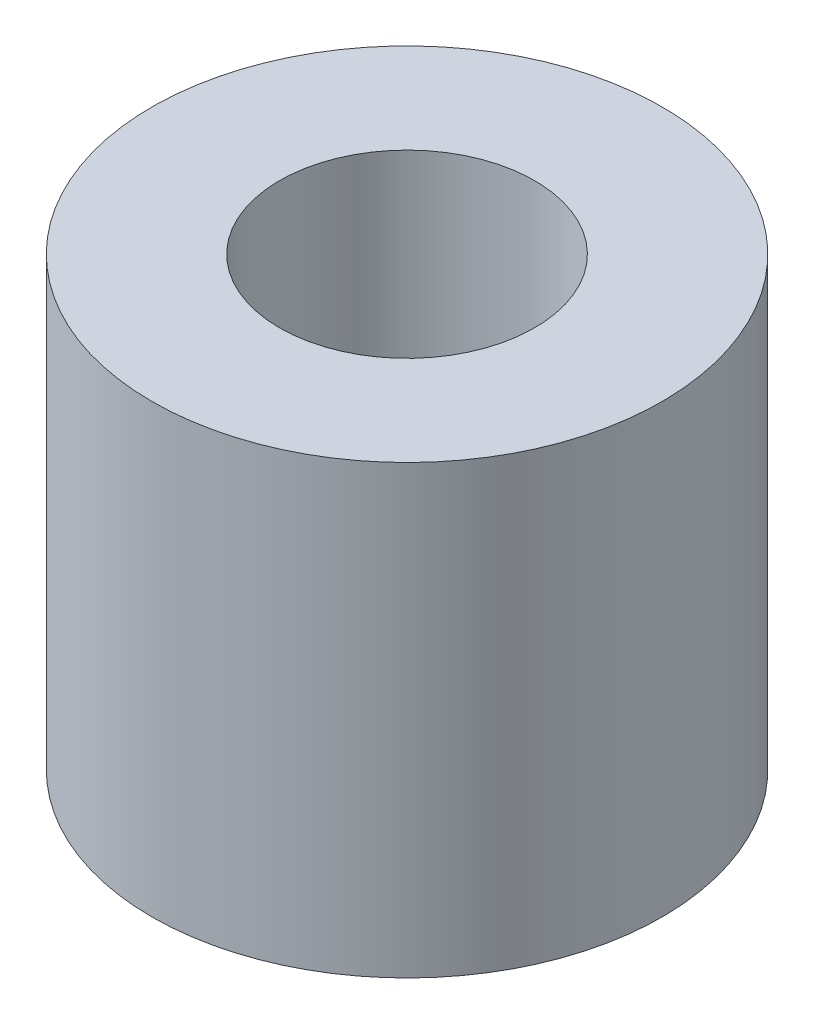
ISO-10303-21;
HEADER;
FILE_DESCRIPTION(('STEP AP214'),'2;1');
FILE_NAME('part.step','',(''),(''),'','','');
FILE_SCHEMA(('AUTOMOTIVE_DESIGN { 1 0 10303 214 1 1 1 1 }'));
ENDSEC;
DATA;
#1=APPLICATION_CONTEXT('core data for automotive mechanical design processes');
#2=APPLICATION_PROTOCOL_DEFINITION('international standard','automotive_design',2000,#1);
#3=PRODUCT_CONTEXT('',#1,'mechanical');
#4=PRODUCT('Part','Part','',(#3));
#5=PRODUCT_RELATED_PRODUCT_CATEGORY('part','',(#4));
#6=PRODUCT_DEFINITION_FORMATION('','',#4);
#7=PRODUCT_DEFINITION_CONTEXT('part definition',#1,'design');
#8=PRODUCT_DEFINITION('design','',#6,#7);
#9=PRODUCT_DEFINITION_SHAPE('','',#8);
#10=(LENGTH_UNIT() NAMED_UNIT(*) SI_UNIT(.MILLI.,.METRE.));
#11=(NAMED_UNIT(*) PLANE_ANGLE_UNIT() SI_UNIT($,.RADIAN.));
#12=(NAMED_UNIT(*) SI_UNIT($,.STERADIAN.) SOLID_ANGLE_UNIT());
#13=UNCERTAINTY_MEASURE_WITH_UNIT(LENGTH_MEASURE(1.E-05),#10,'distance_accuracy_value','');
#14=(GEOMETRIC_REPRESENTATION_CONTEXT(3) GLOBAL_UNCERTAINTY_ASSIGNED_CONTEXT((#13)) GLOBAL_UNIT_ASSIGNED_CONTEXT((#10,
#11,#12)) REPRESENTATION_CONTEXT('',''));
#15=CARTESIAN_POINT('',(0.,0.,0.));
#16=DIRECTION('',(0.,0.,1.));
#17=DIRECTION('',(1.,0.,0.));
#18=AXIS2_PLACEMENT_3D('',#15,#16,#17);
#19=CARTESIAN_POINT('',(0.,3.5,0.));
#20=DIRECTION('',(0.,1.,0.));
#21=DIRECTION('',(0.,0.,1.));
#22=AXIS2_PLACEMENT_3D('',#19,#20,#21);
#23=PLANE('',#22);
#24=CARTESIAN_POINT('',(0.,3.5,0.));
#25=DIRECTION('',(0.,1.,0.));
#26=DIRECTION('',(0.,0.,1.));
#27=AXIS2_PLACEMENT_3D('',#24,#25,#26);
#28=CIRCLE('',#27,2.);
#29=CARTESIAN_POINT('',(0.,3.5,2.));
#30=VERTEX_POINT('',#29);
#31=EDGE_CURVE('E10',#30,#30,#28,.T.);
#32=ORIENTED_EDGE('',*,*,#31,.T.);
#33=EDGE_LOOP('',(#32));
#34=FACE_BOUND('',#33,.T.);
#35=CARTESIAN_POINT('',(0.,3.5,0.));
#36=DIRECTION('',(0.,1.,0.));
#37=DIRECTION('',(0.,0.,1.));
#38=AXIS2_PLACEMENT_3D('',#35,#36,#37);
#39=CIRCLE('',#38,1.);
#40=CARTESIAN_POINT('',(0.,3.5,1.));
#41=VERTEX_POINT('',#40);
#42=EDGE_CURVE('E46',#41,#41,#39,.T.);
#43=ORIENTED_EDGE('',*,*,#42,.F.);
#44=EDGE_LOOP('',(#43));
#45=FACE_BOUND('',#44,.T.);
#46=ADVANCED_FACE('F35',(#34,#45),#23,.T.);
#47=CARTESIAN_POINT('',(0.,0.,0.));
#48=DIRECTION('',(0.,1.,0.));
#49=DIRECTION('',(0.,0.,1.));
#50=AXIS2_PLACEMENT_3D('',#47,#48,#49);
#51=PLANE('',#50);
#52=CARTESIAN_POINT('',(0.,0.,0.));
#53=DIRECTION('',(0.,1.,0.));
#54=DIRECTION('',(0.,0.,1.));
#55=AXIS2_PLACEMENT_3D('',#52,#53,#54);
#56=CIRCLE('',#55,2.);
#57=CARTESIAN_POINT('',(0.,0.,2.));
#58=VERTEX_POINT('',#57);
#59=EDGE_CURVE('E39',#58,#58,#56,.T.);
#60=ORIENTED_EDGE('',*,*,#59,.F.);
#61=EDGE_LOOP('',(#60));
#62=FACE_BOUND('',#61,.T.);
#63=CARTESIAN_POINT('',(0.,0.,0.));
#64=DIRECTION('',(0.,1.,0.));
#65=DIRECTION('',(0.,0.,1.));
#66=AXIS2_PLACEMENT_3D('',#63,#64,#65);
#67=CIRCLE('',#66,1.);
#68=CARTESIAN_POINT('',(0.,0.,1.));
#69=VERTEX_POINT('',#68);
#70=EDGE_CURVE('E48',#69,#69,#67,.T.);
#71=ORIENTED_EDGE('',*,*,#70,.T.);
#72=EDGE_LOOP('',(#71));
#73=FACE_BOUND('',#72,.T.);
#74=ADVANCED_FACE('F58',(#62,#73),#51,.F.);
#75=CARTESIAN_POINT('',(0.,3.5,0.));
#76=DIRECTION('',(0.,-1.,0.));
#77=DIRECTION('',(0.,0.,-1.));
#78=AXIS2_PLACEMENT_3D('',#75,#76,#77);
#79=CYLINDRICAL_SURFACE('',#78,2.);
#80=ORIENTED_EDGE('',*,*,#31,.F.);
#81=EDGE_LOOP('',(#80));
#82=FACE_BOUND('',#81,.T.);
#83=ORIENTED_EDGE('',*,*,#59,.T.);
#84=EDGE_LOOP('',(#83));
#85=FACE_BOUND('',#84,.T.);
#86=ADVANCED_FACE('F37',(#82,#85),#79,.T.);
#87=CARTESIAN_POINT('',(0.,3.5,0.));
#88=DIRECTION('',(0.,-1.,0.));
#89=DIRECTION('',(0.,0.,-1.));
#90=AXIS2_PLACEMENT_3D('',#87,#88,#89);
#91=CYLINDRICAL_SURFACE('',#90,1.);
#92=ORIENTED_EDGE('',*,*,#42,.T.);
#93=EDGE_LOOP('',(#92));
#94=FACE_BOUND('',#93,.T.);
#95=ORIENTED_EDGE('',*,*,#70,.F.);
#96=EDGE_LOOP('',(#95));
#97=FACE_BOUND('',#96,.T.);
#98=ADVANCED_FACE('F54',(#94,#97),#91,.F.);
#99=CLOSED_SHELL('',(#46,#74,#86,#98));
#100=MANIFOLD_SOLID_BREP('B2',#99);
#101=ADVANCED_BREP_SHAPE_REPRESENTATION('',(#18,#100),#14);
#102=SHAPE_DEFINITION_REPRESENTATION(#9,#101);
ENDSEC;
END-ISO-10303-21;
